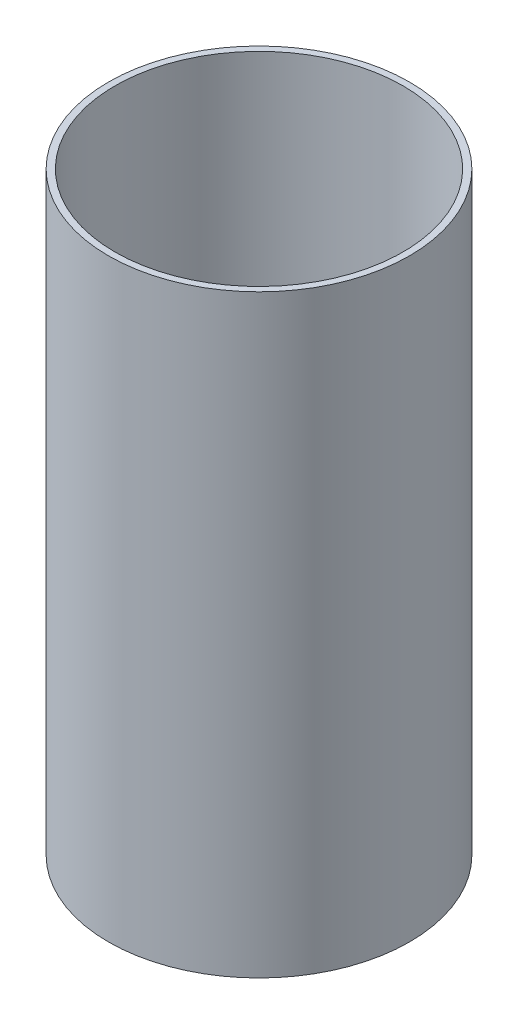
ISO-10303-21;
HEADER;
FILE_DESCRIPTION(('STEP AP214'),'2;1');
FILE_NAME('part.step','',(''),(''),'','','');
FILE_SCHEMA(('AUTOMOTIVE_DESIGN { 1 0 10303 214 1 1 1 1 }'));
ENDSEC;
DATA;
#1=APPLICATION_CONTEXT('core data for automotive mechanical design processes');
#2=APPLICATION_PROTOCOL_DEFINITION('international standard','automotive_design',2000,#1);
#3=PRODUCT_CONTEXT('',#1,'mechanical');
#4=PRODUCT('Part','Part','',(#3));
#5=PRODUCT_RELATED_PRODUCT_CATEGORY('part','',(#4));
#6=PRODUCT_DEFINITION_FORMATION('','',#4);
#7=PRODUCT_DEFINITION_CONTEXT('part definition',#1,'design');
#8=PRODUCT_DEFINITION('design','',#6,#7);
#9=PRODUCT_DEFINITION_SHAPE('','',#8);
#10=(LENGTH_UNIT() NAMED_UNIT(*) SI_UNIT(.MILLI.,.METRE.));
#11=(NAMED_UNIT(*) PLANE_ANGLE_UNIT() SI_UNIT($,.RADIAN.));
#12=(NAMED_UNIT(*) SI_UNIT($,.STERADIAN.) SOLID_ANGLE_UNIT());
#13=UNCERTAINTY_MEASURE_WITH_UNIT(LENGTH_MEASURE(1.E-05),#10,'distance_accuracy_value','');
#14=(GEOMETRIC_REPRESENTATION_CONTEXT(3) GLOBAL_UNCERTAINTY_ASSIGNED_CONTEXT((#13)) GLOBAL_UNIT_ASSIGNED_CONTEXT((#10,
#11,#12)) REPRESENTATION_CONTEXT('',''));
#15=CARTESIAN_POINT('',(0.,0.,0.));
#16=DIRECTION('',(0.,0.,1.));
#17=DIRECTION('',(1.,0.,0.));
#18=AXIS2_PLACEMENT_3D('',#15,#16,#17);
#19=CARTESIAN_POINT('',(0.,300.,0.));
#20=DIRECTION('',(0.,1.,0.));
#21=DIRECTION('',(0.,0.,1.));
#22=AXIS2_PLACEMENT_3D('',#19,#20,#21);
#23=PLANE('',#22);
#24=CARTESIAN_POINT('',(0.,300.,0.));
#25=DIRECTION('',(0.,1.,0.));
#26=DIRECTION('',(0.,0.,1.));
#27=AXIS2_PLACEMENT_3D('',#24,#25,#26);
#28=CIRCLE('',#27,76.);
#29=CARTESIAN_POINT('',(0.,300.,76.));
#30=VERTEX_POINT('',#29);
#31=EDGE_CURVE('E10',#30,#30,#28,.T.);
#32=ORIENTED_EDGE('',*,*,#31,.T.);
#33=EDGE_LOOP('',(#32));
#34=FACE_BOUND('',#33,.T.);
#35=CARTESIAN_POINT('',(0.,300.,0.));
#36=DIRECTION('',(0.,1.,0.));
#37=DIRECTION('',(0.,0.,1.));
#38=AXIS2_PLACEMENT_3D('',#35,#36,#37);
#39=CIRCLE('',#38,72.7);
#40=CARTESIAN_POINT('',(0.,300.,72.7));
#41=VERTEX_POINT('',#40);
#42=EDGE_CURVE('E45',#41,#41,#39,.T.);
#43=ORIENTED_EDGE('',*,*,#42,.F.);
#44=EDGE_LOOP('',(#43));
#45=FACE_BOUND('',#44,.T.);
#46=ADVANCED_FACE('F34',(#34,#45),#23,.T.);
#47=CARTESIAN_POINT('',(0.,0.,0.));
#48=DIRECTION('',(0.,1.,0.));
#49=DIRECTION('',(0.,0.,1.));
#50=AXIS2_PLACEMENT_3D('',#47,#48,#49);
#51=PLANE('',#50);
#52=CARTESIAN_POINT('',(0.,0.,0.));
#53=DIRECTION('',(0.,1.,0.));
#54=DIRECTION('',(0.,0.,1.));
#55=AXIS2_PLACEMENT_3D('',#52,#53,#54);
#56=CIRCLE('',#55,76.);
#57=CARTESIAN_POINT('',(0.,0.,76.));
#58=VERTEX_POINT('',#57);
#59=EDGE_CURVE('E38',#58,#58,#56,.T.);
#60=ORIENTED_EDGE('',*,*,#59,.F.);
#61=EDGE_LOOP('',(#60));
#62=FACE_BOUND('',#61,.T.);
#63=CARTESIAN_POINT('',(0.,0.,0.));
#64=DIRECTION('',(0.,1.,0.));
#65=DIRECTION('',(0.,0.,1.));
#66=AXIS2_PLACEMENT_3D('',#63,#64,#65);
#67=CIRCLE('',#66,72.7);
#68=CARTESIAN_POINT('',(0.,0.,72.7));
#69=VERTEX_POINT('',#68);
#70=EDGE_CURVE('E47',#69,#69,#67,.T.);
#71=ORIENTED_EDGE('',*,*,#70,.T.);
#72=EDGE_LOOP('',(#71));
#73=FACE_BOUND('',#72,.T.);
#74=ADVANCED_FACE('F57',(#62,#73),#51,.F.);
#75=CARTESIAN_POINT('',(0.,300.,0.));
#76=DIRECTION('',(0.,-1.,0.));
#77=DIRECTION('',(0.,0.,-1.));
#78=AXIS2_PLACEMENT_3D('',#75,#76,#77);
#79=CYLINDRICAL_SURFACE('',#78,76.);
#80=ORIENTED_EDGE('',*,*,#31,.F.);
#81=EDGE_LOOP('',(#80));
#82=FACE_BOUND('',#81,.T.);
#83=ORIENTED_EDGE('',*,*,#59,.T.);
#84=EDGE_LOOP('',(#83));
#85=FACE_BOUND('',#84,.T.);
#86=ADVANCED_FACE('F36',(#82,#85),#79,.T.);
#87=CARTESIAN_POINT('',(0.,300.,0.));
#88=DIRECTION('',(0.,-1.,0.));
#89=DIRECTION('',(0.,0.,-1.));
#90=AXIS2_PLACEMENT_3D('',#87,#88,#89);
#91=CYLINDRICAL_SURFACE('',#90,72.7);
#92=ORIENTED_EDGE('',*,*,#42,.T.);
#93=EDGE_LOOP('',(#92));
#94=FACE_BOUND('',#93,.T.);
#95=ORIENTED_EDGE('',*,*,#70,.F.);
#96=EDGE_LOOP('',(#95));
#97=FACE_BOUND('',#96,.T.);
#98=ADVANCED_FACE('F53',(#94,#97),#91,.F.);
#99=CLOSED_SHELL('',(#46,#74,#86,#98));
#100=MANIFOLD_SOLID_BREP('B2',#99);
#101=ADVANCED_BREP_SHAPE_REPRESENTATION('',(#18,#100),#14);
#102=SHAPE_DEFINITION_REPRESENTATION(#9,#101);
ENDSEC;
END-ISO-10303-21;
